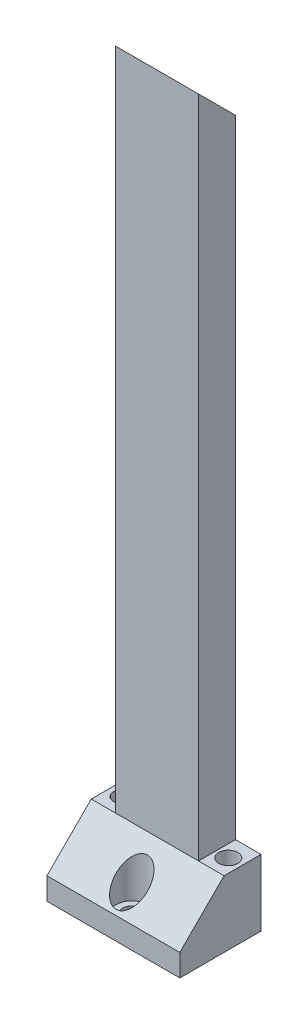
ISO-10303-21;
HEADER;
FILE_DESCRIPTION(('STEP AP214'),'2;1');
FILE_NAME('part.step','',(''),(''),'','','');
FILE_SCHEMA(('AUTOMOTIVE_DESIGN { 1 0 10303 214 1 1 1 1 }'));
ENDSEC;
DATA;
#1=APPLICATION_CONTEXT('core data for automotive mechanical design processes');
#2=APPLICATION_PROTOCOL_DEFINITION('international standard','automotive_design',2000,#1);
#3=PRODUCT_CONTEXT('',#1,'mechanical');
#4=PRODUCT('Part','Part','',(#3));
#5=PRODUCT_RELATED_PRODUCT_CATEGORY('part','',(#4));
#6=PRODUCT_DEFINITION_FORMATION('','',#4);
#7=PRODUCT_DEFINITION_CONTEXT('part definition',#1,'design');
#8=PRODUCT_DEFINITION('design','',#6,#7);
#9=PRODUCT_DEFINITION_SHAPE('','',#8);
#10=(LENGTH_UNIT() NAMED_UNIT(*) SI_UNIT(.MILLI.,.METRE.));
#11=(NAMED_UNIT(*) PLANE_ANGLE_UNIT() SI_UNIT($,.RADIAN.));
#12=(NAMED_UNIT(*) SI_UNIT($,.STERADIAN.) SOLID_ANGLE_UNIT());
#13=UNCERTAINTY_MEASURE_WITH_UNIT(LENGTH_MEASURE(1.E-05),#10,'distance_accuracy_value','');
#14=(GEOMETRIC_REPRESENTATION_CONTEXT(3) GLOBAL_UNCERTAINTY_ASSIGNED_CONTEXT((#13)) GLOBAL_UNIT_ASSIGNED_CONTEXT((#10,
#11,#12)) REPRESENTATION_CONTEXT('',''));
#15=CARTESIAN_POINT('',(0.,0.,0.));
#16=DIRECTION('',(0.,0.,1.));
#17=DIRECTION('',(1.,0.,0.));
#18=AXIS2_PLACEMENT_3D('',#15,#16,#17);
#19=CARTESIAN_POINT('',(0.,15.,0.));
#20=DIRECTION('',(0.,1.,0.));
#21=DIRECTION('',(0.,0.,1.));
#22=AXIS2_PLACEMENT_3D('',#19,#20,#21);
#23=PLANE('',#22);
#24=DIRECTION('',(0.,0.,1.));
#25=VECTOR('',#24,1.);
#26=CARTESIAN_POINT('',(-11.5265383363532,15.,-0.576911475571332));
#27=LINE('',#26,#25);
#28=CARTESIAN_POINT('',(-11.5265383363532,15.,-8.92691147557134));
#29=VERTEX_POINT('',#28);
#30=CARTESIAN_POINT('',(-11.5265383363532,15.,-0.576911475571332));
#31=VERTEX_POINT('',#30);
#32=EDGE_CURVE('E203',#29,#31,#27,.T.);
#33=ORIENTED_EDGE('',*,*,#32,.F.);
#34=DIRECTION('',(1.,0.,0.));
#35=VECTOR('',#34,1.);
#36=CARTESIAN_POINT('',(0.,15.,-8.92691147557134));
#37=LINE('',#36,#35);
#38=CARTESIAN_POINT('',(-17.,15.,-8.92691147557134));
#39=VERTEX_POINT('',#38);
#40=EDGE_CURVE('E245',#39,#29,#37,.T.);
#41=ORIENTED_EDGE('',*,*,#40,.F.);
#42=DIRECTION('',(0.,0.,1.));
#43=VECTOR('',#42,1.);
#44=CARTESIAN_POINT('',(-17.,15.,0.));
#45=LINE('',#44,#43);
#46=CARTESIAN_POINT('',(-17.,15.,-0.576911475571332));
#47=VERTEX_POINT('',#46);
#48=EDGE_CURVE('E249',#39,#47,#45,.T.);
#49=ORIENTED_EDGE('',*,*,#48,.T.);
#50=DIRECTION('',(1.,0.,0.));
#51=VECTOR('',#50,1.);
#52=CARTESIAN_POINT('',(13.,15.,-0.576911475571332));
#53=LINE('',#52,#51);
#54=EDGE_CURVE('E297',#47,#31,#53,.T.);
#55=ORIENTED_EDGE('',*,*,#54,.T.);
#56=EDGE_LOOP('',(#33,#41,#49,#55));
#57=FACE_BOUND('',#56,.T.);
#58=CARTESIAN_POINT('',(-14.,15.,-4.54228303207152));
#59=DIRECTION('',(0.,1.,0.));
#60=DIRECTION('',(0.,0.,1.));
#61=AXIS2_PLACEMENT_3D('',#58,#59,#60);
#62=CIRCLE('',#61,1.91945121261791);
#63=CARTESIAN_POINT('',(-14.,15.,-2.62283181945361));
#64=VERTEX_POINT('',#63);
#65=EDGE_CURVE('E235',#64,#64,#62,.T.);
#66=ORIENTED_EDGE('',*,*,#65,.F.);
#67=EDGE_LOOP('',(#66));
#68=FACE_BOUND('',#67,.T.);
#69=ADVANCED_FACE('F43',(#57,#68),#23,.T.);
#70=CARTESIAN_POINT('',(-2.,15.,5.26842540310277));
#71=DIRECTION('',(0.,-1.,0.));
#72=DIRECTION('',(0.,0.,-1.));
#73=AXIS2_PLACEMENT_3D('',#70,#71,#72);
#74=CYLINDRICAL_SURFACE('',#73,2.13755203705275);
#75=CARTESIAN_POINT('',(-2.,0.,5.26842540310277));
#76=DIRECTION('',(0.,1.,0.));
#77=DIRECTION('',(0.,0.,1.));
#78=AXIS2_PLACEMENT_3D('',#75,#76,#77);
#79=CIRCLE('',#78,2.13755203705275);
#80=CARTESIAN_POINT('',(-2.,0.,7.40597744015552));
#81=VERTEX_POINT('',#80);
#82=EDGE_CURVE('E262',#81,#81,#79,.T.);
#83=ORIENTED_EDGE('',*,*,#82,.F.);
#84=EDGE_LOOP('',(#83));
#85=FACE_BOUND('',#84,.T.);
#86=CARTESIAN_POINT('',(-2.,3.00000000000001,5.26842540310277));
#87=DIRECTION('',(0.,1.,0.));
#88=DIRECTION('',(0.,0.,1.));
#89=AXIS2_PLACEMENT_3D('',#86,#87,#88);
#90=CIRCLE('',#89,2.13755203705275);
#91=CARTESIAN_POINT('',(-2.,3.00000000000001,7.40597744015552));
#92=VERTEX_POINT('',#91);
#93=EDGE_CURVE('E48',#92,#92,#90,.T.);
#94=ORIENTED_EDGE('',*,*,#93,.T.);
#95=EDGE_LOOP('',(#94));
#96=FACE_BOUND('',#95,.T.);
#97=ADVANCED_FACE('F313',(#85,#96),#74,.F.);
#98=CARTESIAN_POINT('',(0.,15.,-8.92691147557134));
#99=DIRECTION('',(0.,0.,-1.));
#100=DIRECTION('',(-1.,0.,0.));
#101=AXIS2_PLACEMENT_3D('',#98,#99,#100);
#102=PLANE('',#101);
#103=DIRECTION('',(1.,0.,0.));
#104=VECTOR('',#103,1.);
#105=CARTESIAN_POINT('',(-142.767342477048,156.65,-8.92691147557134));
#106=LINE('',#105,#104);
#107=CARTESIAN_POINT('',(-11.5265383363532,156.65,-8.92691147557134));
#108=VERTEX_POINT('',#107);
#109=CARTESIAN_POINT('',(7.23265752295243,156.65,-8.92691147557134));
#110=VERTEX_POINT('',#109);
#111=EDGE_CURVE('E196',#108,#110,#106,.T.);
#112=ORIENTED_EDGE('',*,*,#111,.T.);
#113=DIRECTION('',(0.,-1.,0.));
#114=VECTOR('',#113,1.);
#115=CARTESIAN_POINT('',(7.23265752295243,165.,-8.92691147557134));
#116=LINE('',#115,#114);
#117=CARTESIAN_POINT('',(7.23265752295243,15.,-8.92691147557134));
#118=VERTEX_POINT('',#117);
#119=EDGE_CURVE('E219',#110,#118,#116,.T.);
#120=ORIENTED_EDGE('',*,*,#119,.T.);
#121=CARTESIAN_POINT('',(13.,15.,-8.92691147557134));
#122=VERTEX_POINT('',#121);
#123=EDGE_CURVE('E244',#118,#122,#37,.T.);
#124=ORIENTED_EDGE('',*,*,#123,.T.);
#125=DIRECTION('',(0.,-1.,0.));
#126=VECTOR('',#125,1.);
#127=CARTESIAN_POINT('',(13.,15.,-8.92691147557134));
#128=LINE('',#127,#126);
#129=CARTESIAN_POINT('',(13.,0.,-8.92691147557134));
#130=VERTEX_POINT('',#129);
#131=EDGE_CURVE('E257',#122,#130,#128,.T.);
#132=ORIENTED_EDGE('',*,*,#131,.T.);
#133=DIRECTION('',(1.,0.,0.));
#134=VECTOR('',#133,1.);
#135=CARTESIAN_POINT('',(0.,0.,-8.92691147557134));
#136=LINE('',#135,#134);
#137=CARTESIAN_POINT('',(-17.,0.,-8.92691147557134));
#138=VERTEX_POINT('',#137);
#139=EDGE_CURVE('E270',#138,#130,#136,.T.);
#140=ORIENTED_EDGE('',*,*,#139,.F.);
#141=DIRECTION('',(0.,-1.,0.));
#142=VECTOR('',#141,1.);
#143=CARTESIAN_POINT('',(-17.,15.,-8.92691147557134));
#144=LINE('',#143,#142);
#145=EDGE_CURVE('E293',#39,#138,#144,.T.);
#146=ORIENTED_EDGE('',*,*,#145,.F.);
#147=ORIENTED_EDGE('',*,*,#40,.T.);
#148=DIRECTION('',(0.,-1.,0.));
#149=VECTOR('',#148,1.);
#150=CARTESIAN_POINT('',(-11.5265383363532,165.,-8.92691147557134));
#151=LINE('',#150,#149);
#152=EDGE_CURVE('E70',#108,#29,#151,.T.);
#153=ORIENTED_EDGE('',*,*,#152,.F.);
#154=EDGE_LOOP('',(#112,#120,#124,#132,#140,#146,#147,#153));
#155=FACE_BOUND('',#154,.T.);
#156=ADVANCED_FACE('F337',(#155),#102,.T.);
#157=CARTESIAN_POINT('',(-17.,15.,0.));
#158=DIRECTION('',(1.,0.,0.));
#159=DIRECTION('',(0.,0.,-1.));
#160=AXIS2_PLACEMENT_3D('',#157,#158,#159);
#161=PLANE('',#160);
#162=DIRECTION('',(0.,-1.,0.));
#163=VECTOR('',#162,1.);
#164=CARTESIAN_POINT('',(-17.,15.,9.42308852442867));
#165=LINE('',#164,#163);
#166=CARTESIAN_POINT('',(-17.,4.99999999999996,9.42308852442867));
#167=VERTEX_POINT('',#166);
#168=CARTESIAN_POINT('',(-17.,0.,9.42308852442867));
#169=VERTEX_POINT('',#168);
#170=EDGE_CURVE('E290',#167,#169,#165,.T.);
#171=ORIENTED_EDGE('',*,*,#170,.F.);
#172=DIRECTION('',(0.,0.707106781186549,-0.707106781186546));
#173=VECTOR('',#172,1.);
#174=CARTESIAN_POINT('',(-17.,15.,-0.57691147557133));
#175=LINE('',#174,#173);
#176=EDGE_CURVE('E11',#167,#47,#175,.T.);
#177=ORIENTED_EDGE('',*,*,#176,.T.);
#178=ORIENTED_EDGE('',*,*,#48,.F.);
#179=ORIENTED_EDGE('',*,*,#145,.T.);
#180=DIRECTION('',(0.,0.,1.));
#181=VECTOR('',#180,1.);
#182=CARTESIAN_POINT('',(-17.,0.,0.));
#183=LINE('',#182,#181);
#184=EDGE_CURVE('E274',#138,#169,#183,.T.);
#185=ORIENTED_EDGE('',*,*,#184,.T.);
#186=EDGE_LOOP('',(#171,#177,#178,#179,#185));
#187=FACE_BOUND('',#186,.T.);
#188=ADVANCED_FACE('F379',(#187),#161,.F.);
#189=CARTESIAN_POINT('',(0.,15.,9.42308852442867));
#190=DIRECTION('',(0.,0.,-1.));
#191=DIRECTION('',(-1.,0.,0.));
#192=AXIS2_PLACEMENT_3D('',#189,#190,#191);
#193=PLANE('',#192);
#194=DIRECTION('',(0.,-1.,0.));
#195=VECTOR('',#194,1.);
#196=CARTESIAN_POINT('',(13.,15.,9.42308852442867));
#197=LINE('',#196,#195);
#198=CARTESIAN_POINT('',(13.,4.99999999999996,9.42308852442867));
#199=VERTEX_POINT('',#198);
#200=CARTESIAN_POINT('',(13.,0.,9.42308852442867));
#201=VERTEX_POINT('',#200);
#202=EDGE_CURVE('E287',#199,#201,#197,.T.);
#203=ORIENTED_EDGE('',*,*,#202,.F.);
#204=DIRECTION('',(-1.,0.,0.));
#205=VECTOR('',#204,1.);
#206=CARTESIAN_POINT('',(-17.,4.99999999999996,9.42308852442867));
#207=LINE('',#206,#205);
#208=EDGE_CURVE('E54',#199,#167,#207,.T.);
#209=ORIENTED_EDGE('',*,*,#208,.T.);
#210=ORIENTED_EDGE('',*,*,#170,.T.);
#211=DIRECTION('',(1.,0.,0.));
#212=VECTOR('',#211,1.);
#213=CARTESIAN_POINT('',(0.,0.,9.42308852442867));
#214=LINE('',#213,#212);
#215=EDGE_CURVE('E278',#169,#201,#214,.T.);
#216=ORIENTED_EDGE('',*,*,#215,.T.);
#217=EDGE_LOOP('',(#203,#209,#210,#216));
#218=FACE_BOUND('',#217,.T.);
#219=ADVANCED_FACE('F361',(#218),#193,.F.);
#220=CARTESIAN_POINT('',(10.,15.,-4.54228303207152));
#221=DIRECTION('',(0.,-1.,0.));
#222=DIRECTION('',(0.,0.,-1.));
#223=AXIS2_PLACEMENT_3D('',#220,#221,#222);
#224=CYLINDRICAL_SURFACE('',#223,2.15839093441189);
#225=CARTESIAN_POINT('',(10.,15.,-4.54228303207152));
#226=DIRECTION('',(0.,1.,0.));
#227=DIRECTION('',(0.,0.,1.));
#228=AXIS2_PLACEMENT_3D('',#225,#226,#227);
#229=CIRCLE('',#228,2.15839093441189);
#230=CARTESIAN_POINT('',(10.,15.,-2.38389209765963));
#231=VERTEX_POINT('',#230);
#232=EDGE_CURVE('E239',#231,#231,#229,.T.);
#233=ORIENTED_EDGE('',*,*,#232,.T.);
#234=EDGE_LOOP('',(#233));
#235=FACE_BOUND('',#234,.T.);
#236=CARTESIAN_POINT('',(10.,0.,-4.54228303207152));
#237=DIRECTION('',(0.,1.,0.));
#238=DIRECTION('',(0.,0.,1.));
#239=AXIS2_PLACEMENT_3D('',#236,#237,#238);
#240=CIRCLE('',#239,2.15839093441189);
#241=CARTESIAN_POINT('',(10.,0.,-2.38389209765963));
#242=VERTEX_POINT('',#241);
#243=EDGE_CURVE('E266',#242,#242,#240,.T.);
#244=ORIENTED_EDGE('',*,*,#243,.F.);
#245=EDGE_LOOP('',(#244));
#246=FACE_BOUND('',#245,.T.);
#247=ADVANCED_FACE('F358',(#235,#246),#224,.F.);
#248=CARTESIAN_POINT('',(-14.,15.,-4.54228303207152));
#249=DIRECTION('',(0.,-1.,0.));
#250=DIRECTION('',(0.,0.,-1.));
#251=AXIS2_PLACEMENT_3D('',#248,#249,#250);
#252=CYLINDRICAL_SURFACE('',#251,1.91945121261791);
#253=ORIENTED_EDGE('',*,*,#65,.T.);
#254=EDGE_LOOP('',(#253));
#255=FACE_BOUND('',#254,.T.);
#256=CARTESIAN_POINT('',(-14.,0.,-4.54228303207152));
#257=DIRECTION('',(0.,1.,0.));
#258=DIRECTION('',(0.,0.,1.));
#259=AXIS2_PLACEMENT_3D('',#256,#257,#258);
#260=CIRCLE('',#259,1.91945121261791);
#261=CARTESIAN_POINT('',(-14.,0.,-2.62283181945361));
#262=VERTEX_POINT('',#261);
#263=EDGE_CURVE('E258',#262,#262,#260,.T.);
#264=ORIENTED_EDGE('',*,*,#263,.F.);
#265=EDGE_LOOP('',(#264));
#266=FACE_BOUND('',#265,.T.);
#267=ADVANCED_FACE('F350',(#255,#266),#252,.F.);
#268=CARTESIAN_POINT('',(13.,15.,0.));
#269=DIRECTION('',(1.,0.,0.));
#270=DIRECTION('',(0.,0.,-1.));
#271=AXIS2_PLACEMENT_3D('',#268,#269,#270);
#272=PLANE('',#271);
#273=DIRECTION('',(0.,0.,1.));
#274=VECTOR('',#273,1.);
#275=CARTESIAN_POINT('',(13.,15.,0.));
#276=LINE('',#275,#274);
#277=CARTESIAN_POINT('',(13.,15.,-0.576911475571332));
#278=VERTEX_POINT('',#277);
#279=EDGE_CURVE('E253',#122,#278,#276,.T.);
#280=ORIENTED_EDGE('',*,*,#279,.T.);
#281=DIRECTION('',(0.,-0.707106781186549,0.707106781186546));
#282=VECTOR('',#281,1.);
#283=CARTESIAN_POINT('',(13.,14.7115442622143,-0.288455737785668));
#284=LINE('',#283,#282);
#285=EDGE_CURVE('E301',#278,#199,#284,.T.);
#286=ORIENTED_EDGE('',*,*,#285,.T.);
#287=ORIENTED_EDGE('',*,*,#202,.T.);
#288=DIRECTION('',(0.,0.,1.));
#289=VECTOR('',#288,1.);
#290=CARTESIAN_POINT('',(13.,0.,0.));
#291=LINE('',#290,#289);
#292=EDGE_CURVE('E240',#130,#201,#291,.T.);
#293=ORIENTED_EDGE('',*,*,#292,.F.);
#294=ORIENTED_EDGE('',*,*,#131,.F.);
#295=EDGE_LOOP('',(#280,#286,#287,#293,#294));
#296=FACE_BOUND('',#295,.T.);
#297=ADVANCED_FACE('F343',(#296),#272,.T.);
#298=DIRECTION('',(0.,0.,-1.));
#299=VECTOR('',#298,1.);
#300=CARTESIAN_POINT('',(7.23265752295243,15.,-0.576911475571332));
#301=LINE('',#300,#299);
#302=CARTESIAN_POINT('',(7.23265752295243,15.,-0.576911475571332));
#303=VERTEX_POINT('',#302);
#304=EDGE_CURVE('E207',#303,#118,#301,.T.);
#305=ORIENTED_EDGE('',*,*,#304,.F.);
#306=EDGE_CURVE('E296',#303,#278,#53,.T.);
#307=ORIENTED_EDGE('',*,*,#306,.T.);
#308=ORIENTED_EDGE('',*,*,#279,.F.);
#309=ORIENTED_EDGE('',*,*,#123,.F.);
#310=EDGE_LOOP('',(#305,#307,#308,#309));
#311=FACE_BOUND('',#310,.T.);
#312=ORIENTED_EDGE('',*,*,#232,.F.);
#313=EDGE_LOOP('',(#312));
#314=FACE_BOUND('',#313,.T.);
#315=ADVANCED_FACE('F333',(#311,#314),#23,.T.);
#316=CARTESIAN_POINT('',(0.,0.,0.));
#317=DIRECTION('',(0.,1.,0.));
#318=DIRECTION('',(0.,0.,1.));
#319=AXIS2_PLACEMENT_3D('',#316,#317,#318);
#320=PLANE('',#319);
#321=ORIENTED_EDGE('',*,*,#263,.T.);
#322=EDGE_LOOP('',(#321));
#323=FACE_BOUND('',#322,.T.);
#324=ORIENTED_EDGE('',*,*,#82,.T.);
#325=EDGE_LOOP('',(#324));
#326=FACE_BOUND('',#325,.T.);
#327=ORIENTED_EDGE('',*,*,#243,.T.);
#328=EDGE_LOOP('',(#327));
#329=FACE_BOUND('',#328,.T.);
#330=ORIENTED_EDGE('',*,*,#139,.T.);
#331=ORIENTED_EDGE('',*,*,#292,.T.);
#332=ORIENTED_EDGE('',*,*,#215,.F.);
#333=ORIENTED_EDGE('',*,*,#184,.F.);
#334=EDGE_LOOP('',(#330,#331,#332,#333));
#335=FACE_BOUND('',#334,.T.);
#336=ADVANCED_FACE('F328',(#323,#326,#329,#335),#320,.F.);
#337=CARTESIAN_POINT('',(0.,15.,-0.576911475571332));
#338=DIRECTION('',(0.,0.707106781186546,0.707106781186549));
#339=DIRECTION('',(-1.,0.,0.));
#340=AXIS2_PLACEMENT_3D('',#337,#338,#339);
#341=PLANE('',#340);
#342=CARTESIAN_POINT('',(-2.,9.15466312132587,5.26842540310277));
#343=DIRECTION('',(0.,0.707106781186546,0.707106781186549));
#344=DIRECTION('',(0.,0.707106781186549,-0.707106781186546));
#345=AXIS2_PLACEMENT_3D('',#342,#343,#344);
#346=ELLIPSE('',#345,5.01293523059185,3.54468049520044);
#347=CARTESIAN_POINT('',(-2.,12.6993436165263,1.72374490790233));
#348=VERTEX_POINT('',#347);
#349=EDGE_CURVE('E234',#348,#348,#346,.T.);
#350=ORIENTED_EDGE('',*,*,#349,.F.);
#351=EDGE_LOOP('',(#350));
#352=FACE_BOUND('',#351,.T.);
#353=ORIENTED_EDGE('',*,*,#176,.F.);
#354=ORIENTED_EDGE('',*,*,#208,.F.);
#355=ORIENTED_EDGE('',*,*,#285,.F.);
#356=ORIENTED_EDGE('',*,*,#306,.F.);
#357=DIRECTION('',(1.,0.,0.));
#358=VECTOR('',#357,1.);
#359=CARTESIAN_POINT('',(-11.5265383363532,15.,-0.576911475571332));
#360=LINE('',#359,#358);
#361=EDGE_CURVE('E210',#31,#303,#360,.T.);
#362=ORIENTED_EDGE('',*,*,#361,.F.);
#363=ORIENTED_EDGE('',*,*,#54,.F.);
#364=EDGE_LOOP('',(#353,#354,#355,#356,#362,#363));
#365=FACE_BOUND('',#364,.T.);
#366=ADVANCED_FACE('F46',(#352,#365),#341,.T.);
#367=CARTESIAN_POINT('',(-2.,3.00000000000001,5.26842540310277));
#368=DIRECTION('',(0.,1.,0.));
#369=DIRECTION('',(0.,0.,1.));
#370=AXIS2_PLACEMENT_3D('',#367,#368,#369);
#371=CYLINDRICAL_SURFACE('',#370,3.54468049520044);
#372=ORIENTED_EDGE('',*,*,#349,.T.);
#373=EDGE_LOOP('',(#372));
#374=FACE_BOUND('',#373,.T.);
#375=CARTESIAN_POINT('',(-2.,3.00000000000001,5.26842540310277));
#376=DIRECTION('',(0.,1.,0.));
#377=DIRECTION('',(0.,0.,1.));
#378=AXIS2_PLACEMENT_3D('',#375,#376,#377);
#379=CIRCLE('',#378,3.54468049520044);
#380=CARTESIAN_POINT('',(-2.,3.00000000000001,8.81310589830322));
#381=VERTEX_POINT('',#380);
#382=EDGE_CURVE('E230',#381,#381,#379,.T.);
#383=ORIENTED_EDGE('',*,*,#382,.F.);
#384=EDGE_LOOP('',(#383));
#385=FACE_BOUND('',#384,.T.);
#386=ADVANCED_FACE('F319',(#374,#385),#371,.F.);
#387=CARTESIAN_POINT('',(-2.,3.00000000000001,5.26842540310277));
#388=DIRECTION('',(0.,1.,0.));
#389=DIRECTION('',(0.,0.,1.));
#390=AXIS2_PLACEMENT_3D('',#387,#388,#389);
#391=PLANE('',#390);
#392=ORIENTED_EDGE('',*,*,#93,.F.);
#393=EDGE_LOOP('',(#392));
#394=FACE_BOUND('',#393,.T.);
#395=ORIENTED_EDGE('',*,*,#382,.T.);
#396=EDGE_LOOP('',(#395));
#397=FACE_BOUND('',#396,.T.);
#398=ADVANCED_FACE('F315',(#394,#397),#391,.T.);
#399=CARTESIAN_POINT('',(-11.5265383363532,165.,-0.576911475571332));
#400=DIRECTION('',(1.,0.,0.));
#401=DIRECTION('',(0.,0.,-1.));
#402=AXIS2_PLACEMENT_3D('',#399,#400,#401);
#403=PLANE('',#402);
#404=DIRECTION('',(0.,-1.,0.));
#405=VECTOR('',#404,1.);
#406=CARTESIAN_POINT('',(-11.5265383363532,165.,-0.576911475571332));
#407=LINE('',#406,#405);
#408=CARTESIAN_POINT('',(-11.5265383363532,165.,-0.576911475571332));
#409=VERTEX_POINT('',#408);
#410=EDGE_CURVE('E226',#409,#31,#407,.T.);
#411=ORIENTED_EDGE('',*,*,#410,.F.);
#412=DIRECTION('',(0.,-0.707106781186539,-0.707106781186556));
#413=VECTOR('',#412,1.);
#414=CARTESIAN_POINT('',(-11.5265383363532,165.,-0.576911475571332));
#415=LINE('',#414,#413);
#416=EDGE_CURVE('E200',#409,#108,#415,.T.);
#417=ORIENTED_EDGE('',*,*,#416,.T.);
#418=ORIENTED_EDGE('',*,*,#152,.T.);
#419=ORIENTED_EDGE('',*,*,#32,.T.);
#420=EDGE_LOOP('',(#411,#417,#418,#419));
#421=FACE_BOUND('',#420,.T.);
#422=ADVANCED_FACE('F318',(#421),#403,.F.);
#423=CARTESIAN_POINT('',(-11.5265383363532,165.,-0.576911475571332));
#424=DIRECTION('',(0.,0.,-1.));
#425=DIRECTION('',(-1.,0.,0.));
#426=AXIS2_PLACEMENT_3D('',#423,#424,#425);
#427=PLANE('',#426);
#428=ORIENTED_EDGE('',*,*,#361,.T.);
#429=DIRECTION('',(0.,-1.,0.));
#430=VECTOR('',#429,1.);
#431=CARTESIAN_POINT('',(7.23265752295243,165.,-0.576911475571332));
#432=LINE('',#431,#430);
#433=CARTESIAN_POINT('',(7.23265752295243,165.,-0.576911475571332));
#434=VERTEX_POINT('',#433);
#435=EDGE_CURVE('E222',#434,#303,#432,.T.);
#436=ORIENTED_EDGE('',*,*,#435,.F.);
#437=DIRECTION('',(1.,0.,0.));
#438=VECTOR('',#437,1.);
#439=CARTESIAN_POINT('',(-11.5265383363532,165.,-0.576911475571332));
#440=LINE('',#439,#438);
#441=EDGE_CURVE('E204',#409,#434,#440,.T.);
#442=ORIENTED_EDGE('',*,*,#441,.F.);
#443=ORIENTED_EDGE('',*,*,#410,.T.);
#444=EDGE_LOOP('',(#428,#436,#442,#443));
#445=FACE_BOUND('',#444,.T.);
#446=ADVANCED_FACE('F387',(#445),#427,.F.);
#447=CARTESIAN_POINT('',(7.23265752295243,165.,-0.576911475571332));
#448=DIRECTION('',(-1.,0.,0.));
#449=DIRECTION('',(0.,0.,1.));
#450=AXIS2_PLACEMENT_3D('',#447,#448,#449);
#451=PLANE('',#450);
#452=ORIENTED_EDGE('',*,*,#119,.F.);
#453=DIRECTION('',(0.,-0.707106781186539,-0.707106781186556));
#454=VECTOR('',#453,1.);
#455=CARTESIAN_POINT('',(7.23265752295243,165.,-0.576911475571332));
#456=LINE('',#455,#454);
#457=EDGE_CURVE('E188',#434,#110,#456,.T.);
#458=ORIENTED_EDGE('',*,*,#457,.F.);
#459=ORIENTED_EDGE('',*,*,#435,.T.);
#460=ORIENTED_EDGE('',*,*,#304,.T.);
#461=EDGE_LOOP('',(#452,#458,#459,#460));
#462=FACE_BOUND('',#461,.T.);
#463=ADVANCED_FACE('F394',(#462),#451,.F.);
#464=CARTESIAN_POINT('',(-142.767342477048,165.,-0.576911475571332));
#465=DIRECTION('',(0.,-0.707106781186556,0.707106781186539));
#466=DIRECTION('',(0.,-0.707106781186539,-0.707106781186556));
#467=AXIS2_PLACEMENT_3D('',#464,#465,#466);
#468=PLANE('',#467);
#469=DIRECTION('',(-1.,0.,0.));
#470=VECTOR('',#469,1.);
#471=CARTESIAN_POINT('',(3.73650019002447,159.459623788508,-6.11728768706328));
#472=LINE('',#471,#470);
#473=CARTESIAN_POINT('',(3.73650019002447,159.459623788508,-6.11728768706328));
#474=VERTEX_POINT('',#473);
#475=CARTESIAN_POINT('',(-8.97933901180181,159.459623788508,-6.11728768706328));
#476=VERTEX_POINT('',#475);
#477=EDGE_CURVE('E179',#474,#476,#472,.T.);
#478=ORIENTED_EDGE('',*,*,#477,.F.);
#479=DIRECTION('',(0.,-0.707106781186538,-0.707106781186557));
#480=VECTOR('',#479,1.);
#481=CARTESIAN_POINT('',(3.73650019002447,161.999402914527,-3.57750856104447));
#482=LINE('',#481,#480);
#483=CARTESIAN_POINT('',(3.73650019002447,161.999402914527,-3.57750856104447));
#484=VERTEX_POINT('',#483);
#485=EDGE_CURVE('E62',#484,#474,#482,.T.);
#486=ORIENTED_EDGE('',*,*,#485,.F.);
#487=DIRECTION('',(1.,0.,0.));
#488=VECTOR('',#487,1.);
#489=CARTESIAN_POINT('',(3.73650019002447,161.999402914527,-3.57750856104447));
#490=LINE('',#489,#488);
#491=CARTESIAN_POINT('',(-8.97933901180181,161.999402914527,-3.57750856104447));
#492=VERTEX_POINT('',#491);
#493=EDGE_CURVE('E166',#492,#484,#490,.T.);
#494=ORIENTED_EDGE('',*,*,#493,.F.);
#495=DIRECTION('',(0.,0.707106781186538,0.707106781186557));
#496=VECTOR('',#495,1.);
#497=CARTESIAN_POINT('',(-8.97933901180181,161.999402914527,-3.57750856104447));
#498=LINE('',#497,#496);
#499=EDGE_CURVE('E170',#476,#492,#498,.T.);
#500=ORIENTED_EDGE('',*,*,#499,.F.);
#501=EDGE_LOOP('',(#478,#486,#494,#500));
#502=FACE_BOUND('',#501,.T.);
#503=ORIENTED_EDGE('',*,*,#441,.T.);
#504=ORIENTED_EDGE('',*,*,#457,.T.);
#505=ORIENTED_EDGE('',*,*,#111,.F.);
#506=ORIENTED_EDGE('',*,*,#416,.F.);
#507=EDGE_LOOP('',(#503,#504,#505,#506));
#508=FACE_BOUND('',#507,.T.);
#509=ADVANCED_FACE('F391',(#502,#508),#468,.F.);
#510=CARTESIAN_POINT('',(3.73650019002447,159.170975789781,-0.749081436298383));
#511=DIRECTION('',(1.,0.,0.));
#512=DIRECTION('',(0.,0.,-1.));
#513=AXIS2_PLACEMENT_3D('',#510,#511,#512);
#514=PLANE('',#513);
#515=ORIENTED_EDGE('',*,*,#485,.T.);
#516=DIRECTION('',(0.,0.707106781186556,-0.707106781186539));
#517=VECTOR('',#516,1.);
#518=CARTESIAN_POINT('',(3.73650019002447,156.631196663762,-3.2888605623172));
#519=LINE('',#518,#517);
#520=CARTESIAN_POINT('',(3.73650019002447,156.631196663762,-3.2888605623172));
#521=VERTEX_POINT('',#520);
#522=EDGE_CURVE('E141',#521,#474,#519,.T.);
#523=ORIENTED_EDGE('',*,*,#522,.F.);
#524=DIRECTION('',(0.,-0.707106781186538,-0.707106781186557));
#525=VECTOR('',#524,1.);
#526=CARTESIAN_POINT('',(3.73650019002447,159.170975789781,-0.749081436298383));
#527=LINE('',#526,#525);
#528=CARTESIAN_POINT('',(3.73650019002447,159.170975789781,-0.749081436298383));
#529=VERTEX_POINT('',#528);
#530=EDGE_CURVE('E145',#529,#521,#527,.T.);
#531=ORIENTED_EDGE('',*,*,#530,.F.);
#532=DIRECTION('',(0.,0.707106781186556,-0.707106781186539));
#533=VECTOR('',#532,1.);
#534=CARTESIAN_POINT('',(3.73650019002447,159.170975789781,-0.749081436298383));
#535=LINE('',#534,#533);
#536=EDGE_CURVE('E185',#529,#484,#535,.T.);
#537=ORIENTED_EDGE('',*,*,#536,.T.);
#538=EDGE_LOOP('',(#515,#523,#531,#537));
#539=FACE_BOUND('',#538,.T.);
#540=ADVANCED_FACE('F143',(#539),#514,.F.);
#541=CARTESIAN_POINT('',(3.73650019002447,159.170975789781,-0.749081436298383));
#542=DIRECTION('',(0.,0.707106781186539,0.707106781186556));
#543=DIRECTION('',(0.,-0.707106781186556,0.707106781186539));
#544=AXIS2_PLACEMENT_3D('',#541,#542,#543);
#545=PLANE('',#544);
#546=ORIENTED_EDGE('',*,*,#493,.T.);
#547=ORIENTED_EDGE('',*,*,#536,.F.);
#548=DIRECTION('',(1.,0.,0.));
#549=VECTOR('',#548,1.);
#550=CARTESIAN_POINT('',(3.73650019002447,159.170975789781,-0.749081436298383));
#551=LINE('',#550,#549);
#552=CARTESIAN_POINT('',(-8.97933901180181,159.170975789781,-0.749081436298383));
#553=VERTEX_POINT('',#552);
#554=EDGE_CURVE('E152',#553,#529,#551,.T.);
#555=ORIENTED_EDGE('',*,*,#554,.F.);
#556=DIRECTION('',(0.,0.707106781186556,-0.707106781186539));
#557=VECTOR('',#556,1.);
#558=CARTESIAN_POINT('',(-8.97933901180181,159.170975789781,-0.749081436298383));
#559=LINE('',#558,#557);
#560=EDGE_CURVE('E189',#553,#492,#559,.T.);
#561=ORIENTED_EDGE('',*,*,#560,.T.);
#562=EDGE_LOOP('',(#546,#547,#555,#561));
#563=FACE_BOUND('',#562,.T.);
#564=ADVANCED_FACE('F438',(#563),#545,.F.);
#565=CARTESIAN_POINT('',(-8.97933901180181,159.170975789781,-0.749081436298383));
#566=DIRECTION('',(-1.,0.,0.));
#567=DIRECTION('',(0.,0.,1.));
#568=AXIS2_PLACEMENT_3D('',#565,#566,#567);
#569=PLANE('',#568);
#570=ORIENTED_EDGE('',*,*,#499,.T.);
#571=ORIENTED_EDGE('',*,*,#560,.F.);
#572=DIRECTION('',(0.,0.707106781186538,0.707106781186557));
#573=VECTOR('',#572,1.);
#574=CARTESIAN_POINT('',(-8.97933901180181,159.170975789781,-0.749081436298383));
#575=LINE('',#574,#573);
#576=CARTESIAN_POINT('',(-8.97933901180181,156.631196663762,-3.2888605623172));
#577=VERTEX_POINT('',#576);
#578=EDGE_CURVE('E161',#577,#553,#575,.T.);
#579=ORIENTED_EDGE('',*,*,#578,.F.);
#580=DIRECTION('',(0.,0.707106781186556,-0.707106781186539));
#581=VECTOR('',#580,1.);
#582=CARTESIAN_POINT('',(-8.97933901180181,156.631196663762,-3.2888605623172));
#583=LINE('',#582,#581);
#584=EDGE_CURVE('E151',#577,#476,#583,.T.);
#585=ORIENTED_EDGE('',*,*,#584,.T.);
#586=EDGE_LOOP('',(#570,#571,#579,#585));
#587=FACE_BOUND('',#586,.T.);
#588=ADVANCED_FACE('F446',(#587),#569,.F.);
#589=CARTESIAN_POINT('',(3.73650019002447,156.631196663762,-3.2888605623172));
#590=DIRECTION('',(0.,-0.707106781186539,-0.707106781186556));
#591=DIRECTION('',(0.,0.707106781186556,-0.707106781186539));
#592=AXIS2_PLACEMENT_3D('',#589,#590,#591);
#593=PLANE('',#592);
#594=ORIENTED_EDGE('',*,*,#477,.T.);
#595=ORIENTED_EDGE('',*,*,#584,.F.);
#596=DIRECTION('',(-1.,0.,0.));
#597=VECTOR('',#596,1.);
#598=CARTESIAN_POINT('',(3.73650019002447,156.631196663762,-3.2888605623172));
#599=LINE('',#598,#597);
#600=EDGE_CURVE('E155',#521,#577,#599,.T.);
#601=ORIENTED_EDGE('',*,*,#600,.F.);
#602=ORIENTED_EDGE('',*,*,#522,.T.);
#603=EDGE_LOOP('',(#594,#595,#601,#602));
#604=FACE_BOUND('',#603,.T.);
#605=ADVANCED_FACE('F156',(#604),#593,.F.);
#606=CARTESIAN_POINT('',(0.,79.9600286130418,-79.9600286130396));
#607=DIRECTION('',(0.,0.707106781186557,-0.707106781186538));
#608=DIRECTION('',(0.,0.707106781186538,0.707106781186557));
#609=AXIS2_PLACEMENT_3D('',#606,#607,#608);
#610=PLANE('',#609);
#611=ORIENTED_EDGE('',*,*,#530,.T.);
#612=ORIENTED_EDGE('',*,*,#600,.T.);
#613=ORIENTED_EDGE('',*,*,#578,.T.);
#614=ORIENTED_EDGE('',*,*,#554,.T.);
#615=EDGE_LOOP('',(#611,#612,#613,#614));
#616=FACE_BOUND('',#615,.T.);
#617=ADVANCED_FACE('F163',(#616),#610,.T.);
#618=CLOSED_SHELL('',(#69,#97,#156,#188,#219,#247,#267,#297,#315,#336,#366,#386,#398,#422,#446,
#463,#509,#540,#564,#588,#605,#617));
#619=MANIFOLD_SOLID_BREP('B2',#618);
#620=ADVANCED_BREP_SHAPE_REPRESENTATION('',(#18,#619),#14);
#621=SHAPE_DEFINITION_REPRESENTATION(#9,#620);
ENDSEC;
END-ISO-10303-21;
